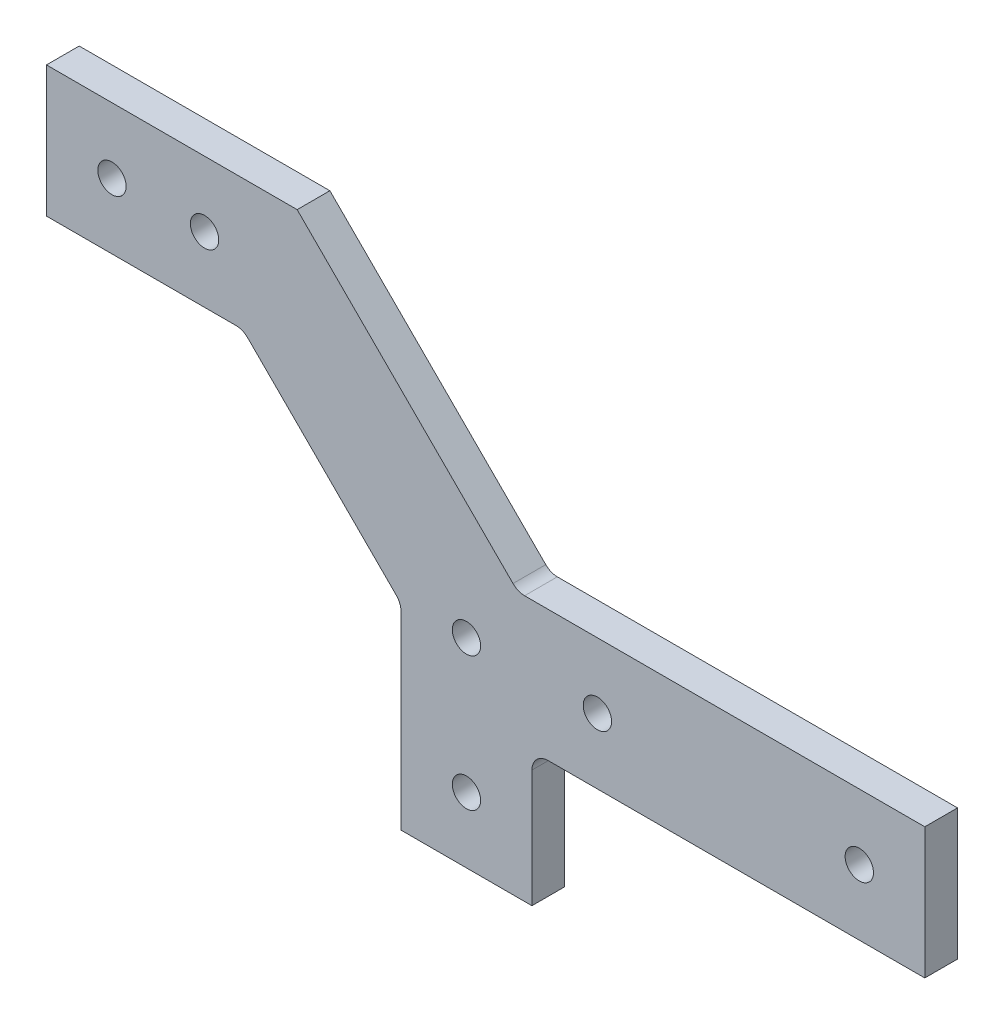
ISO-10303-21;
HEADER;
FILE_DESCRIPTION(('STEP AP214'),'2;1');
FILE_NAME('part.step','',(''),(''),'','','');
FILE_SCHEMA(('AUTOMOTIVE_DESIGN { 1 0 10303 214 1 1 1 1 }'));
ENDSEC;
DATA;
#1=APPLICATION_CONTEXT('core data for automotive mechanical design processes');
#2=APPLICATION_PROTOCOL_DEFINITION('international standard','automotive_design',2000,#1);
#3=PRODUCT_CONTEXT('',#1,'mechanical');
#4=PRODUCT('Part','Part','',(#3));
#5=PRODUCT_RELATED_PRODUCT_CATEGORY('part','',(#4));
#6=PRODUCT_DEFINITION_FORMATION('','',#4);
#7=PRODUCT_DEFINITION_CONTEXT('part definition',#1,'design');
#8=PRODUCT_DEFINITION('design','',#6,#7);
#9=PRODUCT_DEFINITION_SHAPE('','',#8);
#10=(LENGTH_UNIT() NAMED_UNIT(*) SI_UNIT(.MILLI.,.METRE.));
#11=(NAMED_UNIT(*) PLANE_ANGLE_UNIT() SI_UNIT($,.RADIAN.));
#12=(NAMED_UNIT(*) SI_UNIT($,.STERADIAN.) SOLID_ANGLE_UNIT());
#13=UNCERTAINTY_MEASURE_WITH_UNIT(LENGTH_MEASURE(1.E-05),#10,'distance_accuracy_value','');
#14=(GEOMETRIC_REPRESENTATION_CONTEXT(3) GLOBAL_UNCERTAINTY_ASSIGNED_CONTEXT((#13)) GLOBAL_UNIT_ASSIGNED_CONTEXT((#10,
#11,#12)) REPRESENTATION_CONTEXT('',''));
#15=CARTESIAN_POINT('',(0.,0.,0.));
#16=DIRECTION('',(0.,0.,1.));
#17=DIRECTION('',(1.,0.,0.));
#18=AXIS2_PLACEMENT_3D('',#15,#16,#17);
#19=CARTESIAN_POINT('',(12.7,20.1394877578617,6.35));
#20=DIRECTION('',(0.,1.,0.));
#21=DIRECTION('',(-1.,0.,0.));
#22=AXIS2_PLACEMENT_3D('',#19,#20,#21);
#23=PLANE('',#22);
#24=DIRECTION('',(1.,0.,0.));
#25=VECTOR('',#24,1.);
#26=CARTESIAN_POINT('',(12.7,20.1394877578617,0.));
#27=LINE('',#26,#25);
#28=CARTESIAN_POINT('',(-12.7,20.1394877578617,0.));
#29=VERTEX_POINT('',#28);
#30=CARTESIAN_POINT('',(12.7,20.1394877578617,0.));
#31=VERTEX_POINT('',#30);
#32=EDGE_CURVE('E202',#29,#31,#27,.T.);
#33=ORIENTED_EDGE('',*,*,#32,.T.);
#34=DIRECTION('',(0.,0.,-1.));
#35=VECTOR('',#34,1.);
#36=CARTESIAN_POINT('',(12.7,20.1394877578617,6.35));
#37=LINE('',#36,#35);
#38=CARTESIAN_POINT('',(12.7,20.1394877578617,6.35));
#39=VERTEX_POINT('',#38);
#40=EDGE_CURVE('E158',#39,#31,#37,.T.);
#41=ORIENTED_EDGE('',*,*,#40,.F.);
#42=DIRECTION('',(1.,0.,0.));
#43=VECTOR('',#42,1.);
#44=CARTESIAN_POINT('',(12.7,20.1394877578617,6.35));
#45=LINE('',#44,#43);
#46=CARTESIAN_POINT('',(-12.7,20.1394877578617,6.35));
#47=VERTEX_POINT('',#46);
#48=EDGE_CURVE('E144',#47,#39,#45,.T.);
#49=ORIENTED_EDGE('',*,*,#48,.F.);
#50=DIRECTION('',(0.,0.,-1.));
#51=VECTOR('',#50,1.);
#52=CARTESIAN_POINT('',(-12.7,20.1394877578617,6.35));
#53=LINE('',#52,#51);
#54=EDGE_CURVE('E156',#47,#29,#53,.T.);
#55=ORIENTED_EDGE('',*,*,#54,.T.);
#56=EDGE_LOOP('',(#33,#41,#49,#55));
#57=FACE_BOUND('',#56,.T.);
#58=ADVANCED_FACE('F32',(#57),#23,.F.);
#59=CARTESIAN_POINT('',(12.7,46.1,6.35));
#60=DIRECTION('',(-1.,0.,0.));
#61=DIRECTION('',(0.,-1.,0.));
#62=AXIS2_PLACEMENT_3D('',#59,#60,#61);
#63=PLANE('',#62);
#64=DIRECTION('',(0.,1.,0.));
#65=VECTOR('',#64,1.);
#66=CARTESIAN_POINT('',(12.7,46.1,0.));
#67=LINE('',#66,#65);
#68=CARTESIAN_POINT('',(12.7,42.925,0.));
#69=VERTEX_POINT('',#68);
#70=EDGE_CURVE('E247',#31,#69,#67,.T.);
#71=ORIENTED_EDGE('',*,*,#70,.T.);
#72=DIRECTION('',(0.,0.,-1.));
#73=VECTOR('',#72,1.);
#74=CARTESIAN_POINT('',(12.7,42.925,6.35));
#75=LINE('',#74,#73);
#76=CARTESIAN_POINT('',(12.7,42.925,6.35));
#77=VERTEX_POINT('',#76);
#78=EDGE_CURVE('E182',#69,#77,#75,.F.);
#79=ORIENTED_EDGE('',*,*,#78,.T.);
#80=DIRECTION('',(0.,1.,0.));
#81=VECTOR('',#80,1.);
#82=CARTESIAN_POINT('',(12.7,46.1,6.35));
#83=LINE('',#82,#81);
#84=EDGE_CURVE('E160',#39,#77,#83,.T.);
#85=ORIENTED_EDGE('',*,*,#84,.F.);
#86=ORIENTED_EDGE('',*,*,#40,.T.);
#87=EDGE_LOOP('',(#71,#79,#85,#86));
#88=FACE_BOUND('',#87,.T.);
#89=ADVANCED_FACE('F327',(#88),#63,.F.);
#90=CARTESIAN_POINT('',(88.9,46.1,6.35));
#91=DIRECTION('',(0.,1.,0.));
#92=DIRECTION('',(-1.,0.,0.));
#93=AXIS2_PLACEMENT_3D('',#90,#91,#92);
#94=PLANE('',#93);
#95=DIRECTION('',(1.,0.,0.));
#96=VECTOR('',#95,1.);
#97=CARTESIAN_POINT('',(88.9,46.1,6.35));
#98=LINE('',#97,#96);
#99=CARTESIAN_POINT('',(15.875,46.1,6.35));
#100=VERTEX_POINT('',#99);
#101=CARTESIAN_POINT('',(88.9,46.1,6.35));
#102=VERTEX_POINT('',#101);
#103=EDGE_CURVE('E228',#100,#102,#98,.T.);
#104=ORIENTED_EDGE('',*,*,#103,.F.);
#105=DIRECTION('',(0.,0.,-1.));
#106=VECTOR('',#105,1.);
#107=CARTESIAN_POINT('',(15.875,46.1,0.));
#108=LINE('',#107,#106);
#109=CARTESIAN_POINT('',(15.875,46.1,0.));
#110=VERTEX_POINT('',#109);
#111=EDGE_CURVE('E179',#100,#110,#108,.T.);
#112=ORIENTED_EDGE('',*,*,#111,.T.);
#113=DIRECTION('',(1.,0.,0.));
#114=VECTOR('',#113,1.);
#115=CARTESIAN_POINT('',(88.9,46.1,0.));
#116=LINE('',#115,#114);
#117=CARTESIAN_POINT('',(88.9,46.1,0.));
#118=VERTEX_POINT('',#117);
#119=EDGE_CURVE('E250',#110,#118,#116,.T.);
#120=ORIENTED_EDGE('',*,*,#119,.T.);
#121=DIRECTION('',(0.,0.,-1.));
#122=VECTOR('',#121,1.);
#123=CARTESIAN_POINT('',(88.9,46.1,6.35));
#124=LINE('',#123,#122);
#125=EDGE_CURVE('E169',#102,#118,#124,.T.);
#126=ORIENTED_EDGE('',*,*,#125,.F.);
#127=EDGE_LOOP('',(#104,#112,#120,#126));
#128=FACE_BOUND('',#127,.T.);
#129=ADVANCED_FACE('F333',(#128),#94,.F.);
#130=CARTESIAN_POINT('',(88.9,71.5,6.35));
#131=DIRECTION('',(-1.,0.,0.));
#132=DIRECTION('',(0.,0.,1.));
#133=AXIS2_PLACEMENT_3D('',#130,#131,#132);
#134=PLANE('',#133);
#135=DIRECTION('',(0.,1.,0.));
#136=VECTOR('',#135,1.);
#137=CARTESIAN_POINT('',(88.9,71.5,0.));
#138=LINE('',#137,#136);
#139=CARTESIAN_POINT('',(88.9,71.5,0.));
#140=VERTEX_POINT('',#139);
#141=EDGE_CURVE('E252',#118,#140,#138,.T.);
#142=ORIENTED_EDGE('',*,*,#141,.T.);
#143=DIRECTION('',(0.,0.,-1.));
#144=VECTOR('',#143,1.);
#145=CARTESIAN_POINT('',(88.9,71.5,6.35));
#146=LINE('',#145,#144);
#147=CARTESIAN_POINT('',(88.9,71.5,6.35));
#148=VERTEX_POINT('',#147);
#149=EDGE_CURVE('E278',#148,#140,#146,.T.);
#150=ORIENTED_EDGE('',*,*,#149,.F.);
#151=DIRECTION('',(0.,1.,0.));
#152=VECTOR('',#151,1.);
#153=CARTESIAN_POINT('',(88.9,71.5,6.35));
#154=LINE('',#153,#152);
#155=EDGE_CURVE('E230',#102,#148,#154,.T.);
#156=ORIENTED_EDGE('',*,*,#155,.F.);
#157=ORIENTED_EDGE('',*,*,#125,.T.);
#158=EDGE_LOOP('',(#142,#150,#156,#157));
#159=FACE_BOUND('',#158,.T.);
#160=ADVANCED_FACE('F285',(#159),#134,.F.);
#161=CARTESIAN_POINT('',(9.96051224213832,71.5,6.35));
#162=DIRECTION('',(0.,-1.,0.));
#163=DIRECTION('',(0.,0.,-1.));
#164=AXIS2_PLACEMENT_3D('',#161,#162,#163);
#165=PLANE('',#164);
#166=DIRECTION('',(-1.,0.,0.));
#167=VECTOR('',#166,1.);
#168=CARTESIAN_POINT('',(9.96051224213832,71.5,0.));
#169=LINE('',#168,#167);
#170=CARTESIAN_POINT('',(11.2756403026729,71.5,0.));
#171=VERTEX_POINT('',#170);
#172=EDGE_CURVE('E255',#140,#171,#169,.T.);
#173=ORIENTED_EDGE('',*,*,#172,.T.);
#174=DIRECTION('',(0.,0.,-1.));
#175=VECTOR('',#174,1.);
#176=CARTESIAN_POINT('',(11.2756403026729,71.5,6.35));
#177=LINE('',#176,#175);
#178=CARTESIAN_POINT('',(11.2756403026729,71.5,6.35));
#179=VERTEX_POINT('',#178);
#180=EDGE_CURVE('E49',#171,#179,#177,.F.);
#181=ORIENTED_EDGE('',*,*,#180,.T.);
#182=DIRECTION('',(-1.,0.,0.));
#183=VECTOR('',#182,1.);
#184=CARTESIAN_POINT('',(12.7,71.5,6.35));
#185=LINE('',#184,#183);
#186=EDGE_CURVE('E232',#148,#179,#185,.T.);
#187=ORIENTED_EDGE('',*,*,#186,.F.);
#188=ORIENTED_EDGE('',*,*,#149,.T.);
#189=EDGE_LOOP('',(#173,#181,#187,#188));
#190=FACE_BOUND('',#189,.T.);
#191=ADVANCED_FACE('F291',(#190),#165,.F.);
#192=CARTESIAN_POINT('',(-32.8394877578616,114.3,6.35));
#193=DIRECTION('',(-0.707106781186547,-0.707106781186548,0.));
#194=DIRECTION('',(0.707106781186548,-0.707106781186547,0.));
#195=AXIS2_PLACEMENT_3D('',#192,#193,#194);
#196=PLANE('',#195);
#197=DIRECTION('',(-0.707106781186548,0.707106781186547,0.));
#198=VECTOR('',#197,1.);
#199=CARTESIAN_POINT('',(-32.8394877578616,114.3,6.35));
#200=LINE('',#199,#198);
#201=CARTESIAN_POINT('',(9.03057627240563,72.4299359697327,6.35));
#202=VERTEX_POINT('',#201);
#203=CARTESIAN_POINT('',(-32.8394877578616,114.3,6.35));
#204=VERTEX_POINT('',#203);
#205=EDGE_CURVE('E234',#202,#204,#200,.T.);
#206=ORIENTED_EDGE('',*,*,#205,.F.);
#207=DIRECTION('',(0.,0.,-1.));
#208=VECTOR('',#207,1.);
#209=CARTESIAN_POINT('',(9.03057627240563,72.4299359697327,0.));
#210=LINE('',#209,#208);
#211=CARTESIAN_POINT('',(9.03057627240563,72.4299359697327,0.));
#212=VERTEX_POINT('',#211);
#213=EDGE_CURVE('E184',#202,#212,#210,.T.);
#214=ORIENTED_EDGE('',*,*,#213,.T.);
#215=DIRECTION('',(-0.707106781186548,0.707106781186547,0.));
#216=VECTOR('',#215,1.);
#217=CARTESIAN_POINT('',(-32.8394877578616,114.3,0.));
#218=LINE('',#217,#216);
#219=CARTESIAN_POINT('',(-32.8394877578616,114.3,0.));
#220=VERTEX_POINT('',#219);
#221=EDGE_CURVE('E257',#212,#220,#218,.T.);
#222=ORIENTED_EDGE('',*,*,#221,.T.);
#223=DIRECTION('',(0.,0.,-1.));
#224=VECTOR('',#223,1.);
#225=CARTESIAN_POINT('',(-32.8394877578616,114.3,6.35));
#226=LINE('',#225,#224);
#227=EDGE_CURVE('E275',#204,#220,#226,.T.);
#228=ORIENTED_EDGE('',*,*,#227,.F.);
#229=EDGE_LOOP('',(#206,#214,#222,#228));
#230=FACE_BOUND('',#229,.T.);
#231=ADVANCED_FACE('F298',(#230),#196,.F.);
#232=CARTESIAN_POINT('',(-81.4605122421383,114.3,6.35));
#233=DIRECTION('',(0.,-1.,0.));
#234=DIRECTION('',(0.,0.,-1.));
#235=AXIS2_PLACEMENT_3D('',#232,#233,#234);
#236=PLANE('',#235);
#237=DIRECTION('',(-1.,0.,0.));
#238=VECTOR('',#237,1.);
#239=CARTESIAN_POINT('',(-81.4605122421383,114.3,0.));
#240=LINE('',#239,#238);
#241=CARTESIAN_POINT('',(-81.4605122421383,114.3,0.));
#242=VERTEX_POINT('',#241);
#243=EDGE_CURVE('E259',#220,#242,#240,.T.);
#244=ORIENTED_EDGE('',*,*,#243,.T.);
#245=DIRECTION('',(0.,0.,-1.));
#246=VECTOR('',#245,1.);
#247=CARTESIAN_POINT('',(-81.4605122421383,114.3,6.35));
#248=LINE('',#247,#246);
#249=CARTESIAN_POINT('',(-81.4605122421383,114.3,6.35));
#250=VERTEX_POINT('',#249);
#251=EDGE_CURVE('E272',#250,#242,#248,.T.);
#252=ORIENTED_EDGE('',*,*,#251,.F.);
#253=DIRECTION('',(-1.,0.,0.));
#254=VECTOR('',#253,1.);
#255=CARTESIAN_POINT('',(-81.4605122421383,114.3,6.35));
#256=LINE('',#255,#254);
#257=EDGE_CURVE('E236',#204,#250,#256,.T.);
#258=ORIENTED_EDGE('',*,*,#257,.F.);
#259=ORIENTED_EDGE('',*,*,#227,.T.);
#260=EDGE_LOOP('',(#244,#252,#258,#259));
#261=FACE_BOUND('',#260,.T.);
#262=ADVANCED_FACE('F303',(#261),#236,.F.);
#263=CARTESIAN_POINT('',(-81.4605122421383,88.8999999999999,6.35));
#264=DIRECTION('',(1.,0.,0.));
#265=DIRECTION('',(0.,0.,-1.));
#266=AXIS2_PLACEMENT_3D('',#263,#264,#265);
#267=PLANE('',#266);
#268=DIRECTION('',(0.,-1.,0.));
#269=VECTOR('',#268,1.);
#270=CARTESIAN_POINT('',(-81.4605122421383,88.8999999999999,0.));
#271=LINE('',#270,#269);
#272=CARTESIAN_POINT('',(-81.4605122421383,88.8999999999999,0.));
#273=VERTEX_POINT('',#272);
#274=EDGE_CURVE('E261',#242,#273,#271,.T.);
#275=ORIENTED_EDGE('',*,*,#274,.T.);
#276=DIRECTION('',(0.,0.,-1.));
#277=VECTOR('',#276,1.);
#278=CARTESIAN_POINT('',(-81.4605122421383,88.8999999999999,6.35));
#279=LINE('',#278,#277);
#280=CARTESIAN_POINT('',(-81.4605122421383,88.8999999999999,6.35));
#281=VERTEX_POINT('',#280);
#282=EDGE_CURVE('E245',#281,#273,#279,.T.);
#283=ORIENTED_EDGE('',*,*,#282,.F.);
#284=DIRECTION('',(0.,-1.,0.));
#285=VECTOR('',#284,1.);
#286=CARTESIAN_POINT('',(-81.4605122421383,88.8999999999999,6.35));
#287=LINE('',#286,#285);
#288=EDGE_CURVE('E238',#250,#281,#287,.T.);
#289=ORIENTED_EDGE('',*,*,#288,.F.);
#290=ORIENTED_EDGE('',*,*,#251,.T.);
#291=EDGE_LOOP('',(#275,#283,#289,#290));
#292=FACE_BOUND('',#291,.T.);
#293=ADVANCED_FACE('F309',(#292),#267,.F.);
#294=CARTESIAN_POINT('',(-43.3605122421383,88.8999999999999,6.35));
#295=DIRECTION('',(0.,1.,0.));
#296=DIRECTION('',(-1.,0.,0.));
#297=AXIS2_PLACEMENT_3D('',#294,#295,#296);
#298=PLANE('',#297);
#299=DIRECTION('',(1.,0.,0.));
#300=VECTOR('',#299,1.);
#301=CARTESIAN_POINT('',(-43.3605122421383,88.8999999999999,0.));
#302=LINE('',#301,#300);
#303=CARTESIAN_POINT('',(-44.6756403026729,88.8999999999999,0.));
#304=VERTEX_POINT('',#303);
#305=EDGE_CURVE('E263',#273,#304,#302,.T.);
#306=ORIENTED_EDGE('',*,*,#305,.T.);
#307=DIRECTION('',(0.,0.,-1.));
#308=VECTOR('',#307,1.);
#309=CARTESIAN_POINT('',(-44.6756403026729,88.8999999999999,6.35));
#310=LINE('',#309,#308);
#311=CARTESIAN_POINT('',(-44.6756403026729,88.8999999999999,6.35));
#312=VERTEX_POINT('',#311);
#313=EDGE_CURVE('E175',#304,#312,#310,.F.);
#314=ORIENTED_EDGE('',*,*,#313,.T.);
#315=DIRECTION('',(1.,0.,0.));
#316=VECTOR('',#315,1.);
#317=CARTESIAN_POINT('',(-43.3605122421383,88.8999999999999,6.35));
#318=LINE('',#317,#316);
#319=EDGE_CURVE('E240',#281,#312,#318,.T.);
#320=ORIENTED_EDGE('',*,*,#319,.F.);
#321=ORIENTED_EDGE('',*,*,#282,.T.);
#322=EDGE_LOOP('',(#306,#314,#320,#321));
#323=FACE_BOUND('',#322,.T.);
#324=ADVANCED_FACE('F313',(#323),#298,.F.);
#325=CARTESIAN_POINT('',(-12.7,58.2394877578617,6.35));
#326=DIRECTION('',(0.707106781186547,0.707106781186548,0.));
#327=DIRECTION('',(-0.707106781186548,0.707106781186547,0.));
#328=AXIS2_PLACEMENT_3D('',#325,#326,#327);
#329=PLANE('',#328);
#330=DIRECTION('',(0.707106781186548,-0.707106781186547,0.));
#331=VECTOR('',#330,1.);
#332=CARTESIAN_POINT('',(-12.7,58.2394877578617,6.35));
#333=LINE('',#332,#331);
#334=CARTESIAN_POINT('',(-42.4305762724056,87.9700640302673,6.35));
#335=VERTEX_POINT('',#334);
#336=CARTESIAN_POINT('',(-13.6299359697327,59.1694237275944,6.35));
#337=VERTEX_POINT('',#336);
#338=EDGE_CURVE('E243',#335,#337,#333,.T.);
#339=ORIENTED_EDGE('',*,*,#338,.F.);
#340=DIRECTION('',(0.,0.,-1.));
#341=VECTOR('',#340,1.);
#342=CARTESIAN_POINT('',(-42.4305762724056,87.9700640302673,0.));
#343=LINE('',#342,#341);
#344=CARTESIAN_POINT('',(-42.4305762724056,87.9700640302673,0.));
#345=VERTEX_POINT('',#344);
#346=EDGE_CURVE('E167',#335,#345,#343,.T.);
#347=ORIENTED_EDGE('',*,*,#346,.T.);
#348=DIRECTION('',(0.707106781186548,-0.707106781186547,0.));
#349=VECTOR('',#348,1.);
#350=CARTESIAN_POINT('',(-12.7,58.2394877578617,0.));
#351=LINE('',#350,#349);
#352=CARTESIAN_POINT('',(-13.6299359697327,59.1694237275944,0.));
#353=VERTEX_POINT('',#352);
#354=EDGE_CURVE('E266',#345,#353,#351,.T.);
#355=ORIENTED_EDGE('',*,*,#354,.T.);
#356=DIRECTION('',(0.,0.,-1.));
#357=VECTOR('',#356,1.);
#358=CARTESIAN_POINT('',(-13.6299359697327,59.1694237275944,6.35));
#359=LINE('',#358,#357);
#360=EDGE_CURVE('E165',#353,#337,#359,.F.);
#361=ORIENTED_EDGE('',*,*,#360,.T.);
#362=EDGE_LOOP('',(#339,#347,#355,#361));
#363=FACE_BOUND('',#362,.T.);
#364=ADVANCED_FACE('F320',(#363),#329,.F.);
#365=CARTESIAN_POINT('',(-12.7,46.1,6.35));
#366=DIRECTION('',(1.,0.,0.));
#367=DIRECTION('',(0.,0.,-1.));
#368=AXIS2_PLACEMENT_3D('',#365,#366,#367);
#369=PLANE('',#368);
#370=DIRECTION('',(0.,-1.,0.));
#371=VECTOR('',#370,1.);
#372=CARTESIAN_POINT('',(-12.7,20.1394877578617,6.35));
#373=LINE('',#372,#371);
#374=CARTESIAN_POINT('',(-12.7,56.9243596973271,6.35));
#375=VERTEX_POINT('',#374);
#376=EDGE_CURVE('E139',#375,#47,#373,.T.);
#377=ORIENTED_EDGE('',*,*,#376,.F.);
#378=DIRECTION('',(0.,0.,-1.));
#379=VECTOR('',#378,1.);
#380=CARTESIAN_POINT('',(-12.7,56.9243596973271,0.));
#381=LINE('',#380,#379);
#382=CARTESIAN_POINT('',(-12.7,56.9243596973271,0.));
#383=VERTEX_POINT('',#382);
#384=EDGE_CURVE('E177',#375,#383,#381,.T.);
#385=ORIENTED_EDGE('',*,*,#384,.T.);
#386=DIRECTION('',(0.,-1.,0.));
#387=VECTOR('',#386,1.);
#388=CARTESIAN_POINT('',(-12.7,46.1,0.));
#389=LINE('',#388,#387);
#390=EDGE_CURVE('E152',#383,#29,#389,.T.);
#391=ORIENTED_EDGE('',*,*,#390,.T.);
#392=ORIENTED_EDGE('',*,*,#54,.F.);
#393=EDGE_LOOP('',(#377,#385,#391,#392));
#394=FACE_BOUND('',#393,.T.);
#395=ADVANCED_FACE('F162',(#394),#369,.F.);
#396=CARTESIAN_POINT('',(0.,0.,6.35));
#397=DIRECTION('',(0.,0.,1.));
#398=DIRECTION('',(1.,0.,0.));
#399=AXIS2_PLACEMENT_3D('',#396,#397,#398);
#400=PLANE('',#399);
#401=CARTESIAN_POINT('',(0.,58.8,6.35));
#402=DIRECTION('',(0.,0.,1.));
#403=DIRECTION('',(1.,0.,0.));
#404=AXIS2_PLACEMENT_3D('',#401,#402,#403);
#405=CIRCLE('',#404,2.74999999999999);
#406=CARTESIAN_POINT('',(2.74999999999998,58.8,6.35));
#407=VERTEX_POINT('',#406);
#408=EDGE_CURVE('E496',#407,#407,#405,.T.);
#409=ORIENTED_EDGE('',*,*,#408,.F.);
#410=EDGE_LOOP('',(#409));
#411=FACE_BOUND('',#410,.T.);
#412=CARTESIAN_POINT('',(25.4,58.8,6.35));
#413=DIRECTION('',(0.,0.,1.));
#414=DIRECTION('',(1.,0.,0.));
#415=AXIS2_PLACEMENT_3D('',#412,#413,#414);
#416=CIRCLE('',#415,2.74999999999999);
#417=CARTESIAN_POINT('',(28.15,58.8,6.35));
#418=VERTEX_POINT('',#417);
#419=EDGE_CURVE('E500',#418,#418,#416,.T.);
#420=ORIENTED_EDGE('',*,*,#419,.F.);
#421=EDGE_LOOP('',(#420));
#422=FACE_BOUND('',#421,.T.);
#423=CARTESIAN_POINT('',(76.2,58.8,6.35));
#424=DIRECTION('',(0.,0.,1.));
#425=DIRECTION('',(1.,0.,0.));
#426=AXIS2_PLACEMENT_3D('',#423,#424,#425);
#427=CIRCLE('',#426,2.74999999999999);
#428=CARTESIAN_POINT('',(78.95,58.8,6.35));
#429=VERTEX_POINT('',#428);
#430=EDGE_CURVE('E219',#429,#429,#427,.T.);
#431=ORIENTED_EDGE('',*,*,#430,.F.);
#432=EDGE_LOOP('',(#431));
#433=FACE_BOUND('',#432,.T.);
#434=CARTESIAN_POINT('',(-50.7999999999996,101.6,6.35));
#435=DIRECTION('',(0.,0.,1.));
#436=DIRECTION('',(1.,0.,0.));
#437=AXIS2_PLACEMENT_3D('',#434,#435,#436);
#438=CIRCLE('',#437,2.74999999999999);
#439=CARTESIAN_POINT('',(-48.0499999999996,101.6,6.35));
#440=VERTEX_POINT('',#439);
#441=EDGE_CURVE('E207',#440,#440,#438,.T.);
#442=ORIENTED_EDGE('',*,*,#441,.F.);
#443=EDGE_LOOP('',(#442));
#444=FACE_BOUND('',#443,.T.);
#445=CARTESIAN_POINT('',(-68.7605122421383,101.6,6.35));
#446=DIRECTION('',(0.,0.,1.));
#447=DIRECTION('',(1.,0.,0.));
#448=AXIS2_PLACEMENT_3D('',#445,#446,#447);
#449=CIRCLE('',#448,2.74999999999999);
#450=CARTESIAN_POINT('',(-66.0105122421383,101.6,6.35));
#451=VERTEX_POINT('',#450);
#452=EDGE_CURVE('E206',#451,#451,#449,.T.);
#453=ORIENTED_EDGE('',*,*,#452,.F.);
#454=EDGE_LOOP('',(#453));
#455=FACE_BOUND('',#454,.T.);
#456=CARTESIAN_POINT('',(0.,32.8394877578617,6.35));
#457=DIRECTION('',(0.,0.,1.));
#458=DIRECTION('',(1.,0.,0.));
#459=AXIS2_PLACEMENT_3D('',#456,#457,#458);
#460=CIRCLE('',#459,2.74999999999999);
#461=CARTESIAN_POINT('',(2.74999999999998,32.8394877578617,6.35));
#462=VERTEX_POINT('',#461);
#463=EDGE_CURVE('E203',#462,#462,#460,.T.);
#464=ORIENTED_EDGE('',*,*,#463,.F.);
#465=EDGE_LOOP('',(#464));
#466=FACE_BOUND('',#465,.T.);
#467=ORIENTED_EDGE('',*,*,#338,.T.);
#468=CARTESIAN_POINT('',(-15.875,56.9243596973271,6.35));
#469=DIRECTION('',(0.,0.,1.));
#470=DIRECTION('',(1.,0.,0.));
#471=AXIS2_PLACEMENT_3D('',#468,#469,#470);
#472=CIRCLE('',#471,3.175);
#473=EDGE_CURVE('E147',#337,#375,#472,.F.);
#474=ORIENTED_EDGE('',*,*,#473,.T.);
#475=ORIENTED_EDGE('',*,*,#376,.T.);
#476=ORIENTED_EDGE('',*,*,#48,.T.);
#477=ORIENTED_EDGE('',*,*,#84,.T.);
#478=CARTESIAN_POINT('',(15.875,42.925,6.35));
#479=DIRECTION('',(0.,0.,1.));
#480=DIRECTION('',(1.,0.,0.));
#481=AXIS2_PLACEMENT_3D('',#478,#479,#480);
#482=CIRCLE('',#481,3.175);
#483=EDGE_CURVE('E197',#77,#100,#482,.F.);
#484=ORIENTED_EDGE('',*,*,#483,.T.);
#485=ORIENTED_EDGE('',*,*,#103,.T.);
#486=ORIENTED_EDGE('',*,*,#155,.T.);
#487=ORIENTED_EDGE('',*,*,#186,.T.);
#488=CARTESIAN_POINT('',(11.2756403026729,74.675,6.35));
#489=DIRECTION('',(0.,0.,1.));
#490=DIRECTION('',(1.,0.,0.));
#491=AXIS2_PLACEMENT_3D('',#488,#489,#490);
#492=CIRCLE('',#491,3.175);
#493=EDGE_CURVE('E11',#179,#202,#492,.F.);
#494=ORIENTED_EDGE('',*,*,#493,.T.);
#495=ORIENTED_EDGE('',*,*,#205,.T.);
#496=ORIENTED_EDGE('',*,*,#257,.T.);
#497=ORIENTED_EDGE('',*,*,#288,.T.);
#498=ORIENTED_EDGE('',*,*,#319,.T.);
#499=CARTESIAN_POINT('',(-44.6756403026729,85.725,6.35));
#500=DIRECTION('',(0.,0.,1.));
#501=DIRECTION('',(1.,0.,0.));
#502=AXIS2_PLACEMENT_3D('',#499,#500,#501);
#503=CIRCLE('',#502,3.175);
#504=EDGE_CURVE('E190',#312,#335,#503,.F.);
#505=ORIENTED_EDGE('',*,*,#504,.T.);
#506=EDGE_LOOP('',(#467,#474,#475,#476,#477,#484,#485,#486,#487,#494,#495,#496,#497,#498,#505));
#507=FACE_BOUND('',#506,.T.);
#508=ADVANCED_FACE('F142',(#411,#422,#433,#444,#455,#466,#507),#400,.T.);
#509=CARTESIAN_POINT('',(0.,0.,0.));
#510=DIRECTION('',(0.,0.,1.));
#511=DIRECTION('',(1.,0.,0.));
#512=AXIS2_PLACEMENT_3D('',#509,#510,#511);
#513=PLANE('',#512);
#514=CARTESIAN_POINT('',(0.,58.8,0.));
#515=DIRECTION('',(0.,0.,1.));
#516=DIRECTION('',(1.,0.,0.));
#517=AXIS2_PLACEMENT_3D('',#514,#515,#516);
#518=CIRCLE('',#517,2.74999999999999);
#519=CARTESIAN_POINT('',(2.74999999999998,58.8,0.));
#520=VERTEX_POINT('',#519);
#521=EDGE_CURVE('E499',#520,#520,#518,.T.);
#522=ORIENTED_EDGE('',*,*,#521,.T.);
#523=EDGE_LOOP('',(#522));
#524=FACE_BOUND('',#523,.T.);
#525=CARTESIAN_POINT('',(25.4,58.8,0.));
#526=DIRECTION('',(0.,0.,1.));
#527=DIRECTION('',(1.,0.,0.));
#528=AXIS2_PLACEMENT_3D('',#525,#526,#527);
#529=CIRCLE('',#528,2.74999999999999);
#530=CARTESIAN_POINT('',(28.15,58.8,0.));
#531=VERTEX_POINT('',#530);
#532=EDGE_CURVE('E36',#531,#531,#529,.T.);
#533=ORIENTED_EDGE('',*,*,#532,.T.);
#534=EDGE_LOOP('',(#533));
#535=FACE_BOUND('',#534,.T.);
#536=CARTESIAN_POINT('',(76.2,58.8,0.));
#537=DIRECTION('',(0.,0.,1.));
#538=DIRECTION('',(1.,0.,0.));
#539=AXIS2_PLACEMENT_3D('',#536,#537,#538);
#540=CIRCLE('',#539,2.74999999999999);
#541=CARTESIAN_POINT('',(78.95,58.8,0.));
#542=VERTEX_POINT('',#541);
#543=EDGE_CURVE('E214',#542,#542,#540,.T.);
#544=ORIENTED_EDGE('',*,*,#543,.T.);
#545=EDGE_LOOP('',(#544));
#546=FACE_BOUND('',#545,.T.);
#547=CARTESIAN_POINT('',(-50.7999999999996,101.6,0.));
#548=DIRECTION('',(0.,0.,1.));
#549=DIRECTION('',(1.,0.,0.));
#550=AXIS2_PLACEMENT_3D('',#547,#548,#549);
#551=CIRCLE('',#550,2.74999999999999);
#552=CARTESIAN_POINT('',(-48.0499999999996,101.6,0.));
#553=VERTEX_POINT('',#552);
#554=EDGE_CURVE('E204',#553,#553,#551,.T.);
#555=ORIENTED_EDGE('',*,*,#554,.T.);
#556=EDGE_LOOP('',(#555));
#557=FACE_BOUND('',#556,.T.);
#558=CARTESIAN_POINT('',(-68.7605122421383,101.6,0.));
#559=DIRECTION('',(0.,0.,1.));
#560=DIRECTION('',(1.,0.,0.));
#561=AXIS2_PLACEMENT_3D('',#558,#559,#560);
#562=CIRCLE('',#561,2.74999999999999);
#563=CARTESIAN_POINT('',(-66.0105122421383,101.6,0.));
#564=VERTEX_POINT('',#563);
#565=EDGE_CURVE('E211',#564,#564,#562,.T.);
#566=ORIENTED_EDGE('',*,*,#565,.T.);
#567=EDGE_LOOP('',(#566));
#568=FACE_BOUND('',#567,.T.);
#569=CARTESIAN_POINT('',(0.,32.8394877578617,0.));
#570=DIRECTION('',(0.,0.,1.));
#571=DIRECTION('',(1.,0.,0.));
#572=AXIS2_PLACEMENT_3D('',#569,#570,#571);
#573=CIRCLE('',#572,2.74999999999999);
#574=CARTESIAN_POINT('',(2.74999999999998,32.8394877578617,0.));
#575=VERTEX_POINT('',#574);
#576=EDGE_CURVE('E200',#575,#575,#573,.T.);
#577=ORIENTED_EDGE('',*,*,#576,.T.);
#578=EDGE_LOOP('',(#577));
#579=FACE_BOUND('',#578,.T.);
#580=ORIENTED_EDGE('',*,*,#32,.F.);
#581=ORIENTED_EDGE('',*,*,#390,.F.);
#582=CARTESIAN_POINT('',(-15.875,56.9243596973271,0.));
#583=DIRECTION('',(0.,0.,1.));
#584=DIRECTION('',(1.,0.,0.));
#585=AXIS2_PLACEMENT_3D('',#582,#583,#584);
#586=CIRCLE('',#585,3.175);
#587=EDGE_CURVE('E192',#383,#353,#586,.T.);
#588=ORIENTED_EDGE('',*,*,#587,.T.);
#589=ORIENTED_EDGE('',*,*,#354,.F.);
#590=CARTESIAN_POINT('',(-44.6756403026729,85.725,0.));
#591=DIRECTION('',(0.,0.,1.));
#592=DIRECTION('',(1.,0.,0.));
#593=AXIS2_PLACEMENT_3D('',#590,#591,#592);
#594=CIRCLE('',#593,3.175);
#595=EDGE_CURVE('E188',#345,#304,#594,.T.);
#596=ORIENTED_EDGE('',*,*,#595,.T.);
#597=ORIENTED_EDGE('',*,*,#305,.F.);
#598=ORIENTED_EDGE('',*,*,#274,.F.);
#599=ORIENTED_EDGE('',*,*,#243,.F.);
#600=ORIENTED_EDGE('',*,*,#221,.F.);
#601=CARTESIAN_POINT('',(11.2756403026729,74.675,0.));
#602=DIRECTION('',(0.,0.,1.));
#603=DIRECTION('',(1.,0.,0.));
#604=AXIS2_PLACEMENT_3D('',#601,#602,#603);
#605=CIRCLE('',#604,3.175);
#606=EDGE_CURVE('E41',#212,#171,#605,.T.);
#607=ORIENTED_EDGE('',*,*,#606,.T.);
#608=ORIENTED_EDGE('',*,*,#172,.F.);
#609=ORIENTED_EDGE('',*,*,#141,.F.);
#610=ORIENTED_EDGE('',*,*,#119,.F.);
#611=CARTESIAN_POINT('',(15.875,42.925,0.));
#612=DIRECTION('',(0.,0.,1.));
#613=DIRECTION('',(1.,0.,0.));
#614=AXIS2_PLACEMENT_3D('',#611,#612,#613);
#615=CIRCLE('',#614,3.175);
#616=EDGE_CURVE('E195',#110,#69,#615,.T.);
#617=ORIENTED_EDGE('',*,*,#616,.T.);
#618=ORIENTED_EDGE('',*,*,#70,.F.);
#619=EDGE_LOOP('',(#580,#581,#588,#589,#596,#597,#598,#599,#600,#607,#608,#609,#610,#617,#618));
#620=FACE_BOUND('',#619,.T.);
#621=ADVANCED_FACE('F290',(#524,#535,#546,#557,#568,#579,#620),#513,.F.);
#622=CARTESIAN_POINT('',(-44.6756403026729,85.725,6.35));
#623=DIRECTION('',(0.,0.,1.));
#624=DIRECTION('',(1.,0.,0.));
#625=AXIS2_PLACEMENT_3D('',#622,#623,#624);
#626=CYLINDRICAL_SURFACE('',#625,3.175);
#627=ORIENTED_EDGE('',*,*,#504,.F.);
#628=ORIENTED_EDGE('',*,*,#313,.F.);
#629=ORIENTED_EDGE('',*,*,#595,.F.);
#630=ORIENTED_EDGE('',*,*,#346,.F.);
#631=EDGE_LOOP('',(#627,#628,#629,#630));
#632=FACE_BOUND('',#631,.T.);
#633=ADVANCED_FACE('F316',(#632),#626,.F.);
#634=CARTESIAN_POINT('',(-15.875,56.9243596973271,6.35));
#635=DIRECTION('',(0.,0.,1.));
#636=DIRECTION('',(1.,0.,0.));
#637=AXIS2_PLACEMENT_3D('',#634,#635,#636);
#638=CYLINDRICAL_SURFACE('',#637,3.175);
#639=ORIENTED_EDGE('',*,*,#473,.F.);
#640=ORIENTED_EDGE('',*,*,#360,.F.);
#641=ORIENTED_EDGE('',*,*,#587,.F.);
#642=ORIENTED_EDGE('',*,*,#384,.F.);
#643=EDGE_LOOP('',(#639,#640,#641,#642));
#644=FACE_BOUND('',#643,.T.);
#645=ADVANCED_FACE('F324',(#644),#638,.F.);
#646=CARTESIAN_POINT('',(15.875,42.925,6.35));
#647=DIRECTION('',(0.,0.,1.));
#648=DIRECTION('',(1.,0.,0.));
#649=AXIS2_PLACEMENT_3D('',#646,#647,#648);
#650=CYLINDRICAL_SURFACE('',#649,3.175);
#651=ORIENTED_EDGE('',*,*,#483,.F.);
#652=ORIENTED_EDGE('',*,*,#78,.F.);
#653=ORIENTED_EDGE('',*,*,#616,.F.);
#654=ORIENTED_EDGE('',*,*,#111,.F.);
#655=EDGE_LOOP('',(#651,#652,#653,#654));
#656=FACE_BOUND('',#655,.T.);
#657=ADVANCED_FACE('F332',(#656),#650,.F.);
#658=CARTESIAN_POINT('',(11.2756403026729,74.675,6.35));
#659=DIRECTION('',(0.,0.,1.));
#660=DIRECTION('',(1.,0.,0.));
#661=AXIS2_PLACEMENT_3D('',#658,#659,#660);
#662=CYLINDRICAL_SURFACE('',#661,3.175);
#663=ORIENTED_EDGE('',*,*,#493,.F.);
#664=ORIENTED_EDGE('',*,*,#180,.F.);
#665=ORIENTED_EDGE('',*,*,#606,.F.);
#666=ORIENTED_EDGE('',*,*,#213,.F.);
#667=EDGE_LOOP('',(#663,#664,#665,#666));
#668=FACE_BOUND('',#667,.T.);
#669=ADVANCED_FACE('F34',(#668),#662,.F.);
#670=CARTESIAN_POINT('',(0.,32.8394877578617,6.35));
#671=DIRECTION('',(0.,0.,1.));
#672=DIRECTION('',(1.,0.,0.));
#673=AXIS2_PLACEMENT_3D('',#670,#671,#672);
#674=CYLINDRICAL_SURFACE('',#673,2.74999999999999);
#675=ORIENTED_EDGE('',*,*,#463,.T.);
#676=EDGE_LOOP('',(#675));
#677=FACE_BOUND('',#676,.T.);
#678=ORIENTED_EDGE('',*,*,#576,.F.);
#679=EDGE_LOOP('',(#678));
#680=FACE_BOUND('',#679,.T.);
#681=ADVANCED_FACE('F354',(#677,#680),#674,.F.);
#682=CARTESIAN_POINT('',(-68.7605122421383,101.6,6.35));
#683=DIRECTION('',(0.,0.,1.));
#684=DIRECTION('',(1.,0.,0.));
#685=AXIS2_PLACEMENT_3D('',#682,#683,#684);
#686=CYLINDRICAL_SURFACE('',#685,2.74999999999999);
#687=ORIENTED_EDGE('',*,*,#452,.T.);
#688=EDGE_LOOP('',(#687));
#689=FACE_BOUND('',#688,.T.);
#690=ORIENTED_EDGE('',*,*,#565,.F.);
#691=EDGE_LOOP('',(#690));
#692=FACE_BOUND('',#691,.T.);
#693=ADVANCED_FACE('F358',(#689,#692),#686,.F.);
#694=CARTESIAN_POINT('',(-50.7999999999996,101.6,6.35));
#695=DIRECTION('',(0.,0.,1.));
#696=DIRECTION('',(1.,0.,0.));
#697=AXIS2_PLACEMENT_3D('',#694,#695,#696);
#698=CYLINDRICAL_SURFACE('',#697,2.74999999999999);
#699=ORIENTED_EDGE('',*,*,#441,.T.);
#700=EDGE_LOOP('',(#699));
#701=FACE_BOUND('',#700,.T.);
#702=ORIENTED_EDGE('',*,*,#554,.F.);
#703=EDGE_LOOP('',(#702));
#704=FACE_BOUND('',#703,.T.);
#705=ADVANCED_FACE('F364',(#701,#704),#698,.F.);
#706=CARTESIAN_POINT('',(76.2,58.8,6.35));
#707=DIRECTION('',(0.,0.,1.));
#708=DIRECTION('',(1.,0.,0.));
#709=AXIS2_PLACEMENT_3D('',#706,#707,#708);
#710=CYLINDRICAL_SURFACE('',#709,2.74999999999999);
#711=ORIENTED_EDGE('',*,*,#430,.T.);
#712=EDGE_LOOP('',(#711));
#713=FACE_BOUND('',#712,.T.);
#714=ORIENTED_EDGE('',*,*,#543,.F.);
#715=EDGE_LOOP('',(#714));
#716=FACE_BOUND('',#715,.T.);
#717=ADVANCED_FACE('F461',(#713,#716),#710,.F.);
#718=CARTESIAN_POINT('',(25.4,58.8,6.35));
#719=DIRECTION('',(0.,0.,1.));
#720=DIRECTION('',(1.,0.,0.));
#721=AXIS2_PLACEMENT_3D('',#718,#719,#720);
#722=CYLINDRICAL_SURFACE('',#721,2.74999999999999);
#723=ORIENTED_EDGE('',*,*,#419,.T.);
#724=EDGE_LOOP('',(#723));
#725=FACE_BOUND('',#724,.T.);
#726=ORIENTED_EDGE('',*,*,#532,.F.);
#727=EDGE_LOOP('',(#726));
#728=FACE_BOUND('',#727,.T.);
#729=ADVANCED_FACE('F468',(#725,#728),#722,.F.);
#730=CARTESIAN_POINT('',(0.,58.8,6.35));
#731=DIRECTION('',(0.,0.,1.));
#732=DIRECTION('',(1.,0.,0.));
#733=AXIS2_PLACEMENT_3D('',#730,#731,#732);
#734=CYLINDRICAL_SURFACE('',#733,2.74999999999999);
#735=ORIENTED_EDGE('',*,*,#408,.T.);
#736=EDGE_LOOP('',(#735));
#737=FACE_BOUND('',#736,.T.);
#738=ORIENTED_EDGE('',*,*,#521,.F.);
#739=EDGE_LOOP('',(#738));
#740=FACE_BOUND('',#739,.T.);
#741=ADVANCED_FACE('F477',(#737,#740),#734,.F.);
#742=CLOSED_SHELL('',(#58,#89,#129,#160,#191,#231,#262,#293,#324,#364,#395,#508,#621,#633,#645,
#657,#669,#681,#693,#705,#717,#729,#741));
#743=MANIFOLD_SOLID_BREP('B2',#742);
#744=ADVANCED_BREP_SHAPE_REPRESENTATION('',(#18,#743),#14);
#745=SHAPE_DEFINITION_REPRESENTATION(#9,#744);
ENDSEC;
END-ISO-10303-21;
